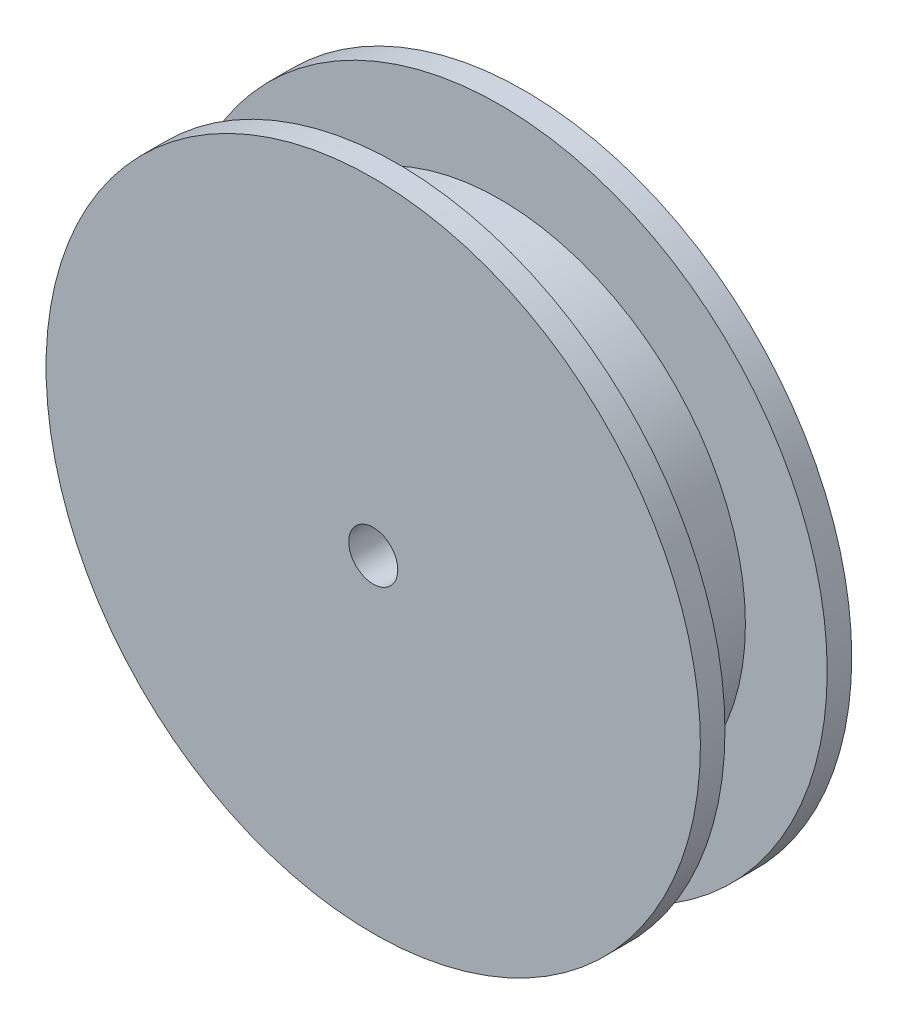
ISO-10303-21;
HEADER;
FILE_DESCRIPTION(('STEP AP214'),'2;1');
FILE_NAME('part.step','',(''),(''),'','','');
FILE_SCHEMA(('AUTOMOTIVE_DESIGN { 1 0 10303 214 1 1 1 1 }'));
ENDSEC;
DATA;
#1=APPLICATION_CONTEXT('core data for automotive mechanical design processes');
#2=APPLICATION_PROTOCOL_DEFINITION('international standard','automotive_design',2000,#1);
#3=PRODUCT_CONTEXT('',#1,'mechanical');
#4=PRODUCT('Part','Part','',(#3));
#5=PRODUCT_RELATED_PRODUCT_CATEGORY('part','',(#4));
#6=PRODUCT_DEFINITION_FORMATION('','',#4);
#7=PRODUCT_DEFINITION_CONTEXT('part definition',#1,'design');
#8=PRODUCT_DEFINITION('design','',#6,#7);
#9=PRODUCT_DEFINITION_SHAPE('','',#8);
#10=(LENGTH_UNIT() NAMED_UNIT(*) SI_UNIT(.MILLI.,.METRE.));
#11=(NAMED_UNIT(*) PLANE_ANGLE_UNIT() SI_UNIT($,.RADIAN.));
#12=(NAMED_UNIT(*) SI_UNIT($,.STERADIAN.) SOLID_ANGLE_UNIT());
#13=UNCERTAINTY_MEASURE_WITH_UNIT(LENGTH_MEASURE(1.E-05),#10,'distance_accuracy_value','');
#14=(GEOMETRIC_REPRESENTATION_CONTEXT(3) GLOBAL_UNCERTAINTY_ASSIGNED_CONTEXT((#13)) GLOBAL_UNIT_ASSIGNED_CONTEXT((#10,
#11,#12)) REPRESENTATION_CONTEXT('',''));
#15=CARTESIAN_POINT('',(0.,0.,0.));
#16=DIRECTION('',(0.,0.,1.));
#17=DIRECTION('',(1.,0.,0.));
#18=AXIS2_PLACEMENT_3D('',#15,#16,#17);
#19=CARTESIAN_POINT('',(0.,0.,18.5));
#20=DIRECTION('',(0.,0.,-1.));
#21=DIRECTION('',(-1.,0.,0.));
#22=AXIS2_PLACEMENT_3D('',#19,#20,#21);
#23=CYLINDRICAL_SURFACE('',#22,40.);
#24=CARTESIAN_POINT('',(0.,0.,0.));
#25=DIRECTION('',(0.,0.,1.));
#26=DIRECTION('',(1.,0.,0.));
#27=AXIS2_PLACEMENT_3D('',#24,#25,#26);
#28=CIRCLE('',#27,40.);
#29=CARTESIAN_POINT('',(40.,0.,0.));
#30=VERTEX_POINT('',#29);
#31=EDGE_CURVE('E50',#30,#30,#28,.T.);
#32=ORIENTED_EDGE('',*,*,#31,.T.);
#33=EDGE_LOOP('',(#32));
#34=FACE_BOUND('',#33,.T.);
#35=CARTESIAN_POINT('',(0.,0.,3.));
#36=DIRECTION('',(0.,0.,1.));
#37=DIRECTION('',(1.,0.,0.));
#38=AXIS2_PLACEMENT_3D('',#35,#36,#37);
#39=CIRCLE('',#38,40.);
#40=CARTESIAN_POINT('',(40.,0.,3.));
#41=VERTEX_POINT('',#40);
#42=EDGE_CURVE('E54',#41,#41,#39,.T.);
#43=ORIENTED_EDGE('',*,*,#42,.F.);
#44=EDGE_LOOP('',(#43));
#45=FACE_BOUND('',#44,.T.);
#46=ADVANCED_FACE('F33',(#34,#45),#23,.T.);
#47=CARTESIAN_POINT('',(0.,0.,15.5));
#48=DIRECTION('',(0.,0.,1.));
#49=DIRECTION('',(1.,0.,0.));
#50=AXIS2_PLACEMENT_3D('',#47,#48,#49);
#51=CIRCLE('',#50,40.);
#52=CARTESIAN_POINT('',(40.,0.,15.5));
#53=VERTEX_POINT('',#52);
#54=EDGE_CURVE('E37',#53,#53,#51,.T.);
#55=ORIENTED_EDGE('',*,*,#54,.T.);
#56=EDGE_LOOP('',(#55));
#57=FACE_BOUND('',#56,.T.);
#58=CARTESIAN_POINT('',(0.,0.,18.5));
#59=DIRECTION('',(0.,0.,1.));
#60=DIRECTION('',(1.,0.,0.));
#61=AXIS2_PLACEMENT_3D('',#58,#59,#60);
#62=CIRCLE('',#61,40.);
#63=CARTESIAN_POINT('',(40.,0.,18.5));
#64=VERTEX_POINT('',#63);
#65=EDGE_CURVE('E41',#64,#64,#62,.T.);
#66=ORIENTED_EDGE('',*,*,#65,.F.);
#67=EDGE_LOOP('',(#66));
#68=FACE_BOUND('',#67,.T.);
#69=ADVANCED_FACE('F35',(#57,#68),#23,.T.);
#70=CARTESIAN_POINT('',(0.,0.,18.5));
#71=DIRECTION('',(0.,0.,-1.));
#72=DIRECTION('',(-1.,0.,0.));
#73=AXIS2_PLACEMENT_3D('',#70,#71,#72);
#74=CYLINDRICAL_SURFACE('',#73,3.);
#75=CARTESIAN_POINT('',(0.,0.,18.5));
#76=DIRECTION('',(0.,0.,1.));
#77=DIRECTION('',(1.,0.,0.));
#78=AXIS2_PLACEMENT_3D('',#75,#76,#77);
#79=CIRCLE('',#78,3.);
#80=CARTESIAN_POINT('',(3.,0.,18.5));
#81=VERTEX_POINT('',#80);
#82=EDGE_CURVE('E10',#81,#81,#79,.T.);
#83=ORIENTED_EDGE('',*,*,#82,.T.);
#84=EDGE_LOOP('',(#83));
#85=FACE_BOUND('',#84,.T.);
#86=CARTESIAN_POINT('',(0.,0.,0.));
#87=DIRECTION('',(0.,0.,1.));
#88=DIRECTION('',(1.,0.,0.));
#89=AXIS2_PLACEMENT_3D('',#86,#87,#88);
#90=CIRCLE('',#89,3.);
#91=CARTESIAN_POINT('',(3.,0.,0.));
#92=VERTEX_POINT('',#91);
#93=EDGE_CURVE('E46',#92,#92,#90,.T.);
#94=ORIENTED_EDGE('',*,*,#93,.F.);
#95=EDGE_LOOP('',(#94));
#96=FACE_BOUND('',#95,.T.);
#97=ADVANCED_FACE('F87',(#85,#96),#74,.F.);
#98=CARTESIAN_POINT('',(0.,0.,18.5));
#99=DIRECTION('',(0.,0.,1.));
#100=DIRECTION('',(1.,0.,0.));
#101=AXIS2_PLACEMENT_3D('',#98,#99,#100);
#102=PLANE('',#101);
#103=ORIENTED_EDGE('',*,*,#65,.T.);
#104=EDGE_LOOP('',(#103));
#105=FACE_BOUND('',#104,.T.);
#106=ORIENTED_EDGE('',*,*,#82,.F.);
#107=EDGE_LOOP('',(#106));
#108=FACE_BOUND('',#107,.T.);
#109=ADVANCED_FACE('F94',(#105,#108),#102,.T.);
#110=CARTESIAN_POINT('',(0.,0.,0.));
#111=DIRECTION('',(0.,0.,1.));
#112=DIRECTION('',(1.,0.,0.));
#113=AXIS2_PLACEMENT_3D('',#110,#111,#112);
#114=PLANE('',#113);
#115=ORIENTED_EDGE('',*,*,#31,.F.);
#116=EDGE_LOOP('',(#115));
#117=FACE_BOUND('',#116,.T.);
#118=ORIENTED_EDGE('',*,*,#93,.T.);
#119=EDGE_LOOP('',(#118));
#120=FACE_BOUND('',#119,.T.);
#121=ADVANCED_FACE('F80',(#117,#120),#114,.F.);
#122=CARTESIAN_POINT('',(0.,0.,15.5));
#123=DIRECTION('',(0.,0.,1.));
#124=DIRECTION('',(1.,0.,0.));
#125=AXIS2_PLACEMENT_3D('',#122,#123,#124);
#126=PLANE('',#125);
#127=CARTESIAN_POINT('',(0.,0.,15.5));
#128=DIRECTION('',(0.,0.,1.));
#129=DIRECTION('',(1.,0.,0.));
#130=AXIS2_PLACEMENT_3D('',#127,#128,#129);
#131=CIRCLE('',#130,30.);
#132=CARTESIAN_POINT('',(30.,0.,15.5));
#133=VERTEX_POINT('',#132);
#134=EDGE_CURVE('E56',#133,#133,#131,.T.);
#135=ORIENTED_EDGE('',*,*,#134,.T.);
#136=EDGE_LOOP('',(#135));
#137=FACE_BOUND('',#136,.T.);
#138=ORIENTED_EDGE('',*,*,#54,.F.);
#139=EDGE_LOOP('',(#138));
#140=FACE_BOUND('',#139,.T.);
#141=ADVANCED_FACE('F72',(#137,#140),#126,.F.);
#142=CARTESIAN_POINT('',(0.,0.,3.));
#143=DIRECTION('',(0.,0.,1.));
#144=DIRECTION('',(1.,0.,0.));
#145=AXIS2_PLACEMENT_3D('',#142,#143,#144);
#146=PLANE('',#145);
#147=CARTESIAN_POINT('',(0.,0.,3.));
#148=DIRECTION('',(0.,0.,1.));
#149=DIRECTION('',(1.,0.,0.));
#150=AXIS2_PLACEMENT_3D('',#147,#148,#149);
#151=CIRCLE('',#150,30.);
#152=CARTESIAN_POINT('',(30.,0.,3.));
#153=VERTEX_POINT('',#152);
#154=EDGE_CURVE('E61',#153,#153,#151,.T.);
#155=ORIENTED_EDGE('',*,*,#154,.F.);
#156=EDGE_LOOP('',(#155));
#157=FACE_BOUND('',#156,.T.);
#158=ORIENTED_EDGE('',*,*,#42,.T.);
#159=EDGE_LOOP('',(#158));
#160=FACE_BOUND('',#159,.T.);
#161=ADVANCED_FACE('F70',(#157,#160),#146,.T.);
#162=CARTESIAN_POINT('',(0.,0.,15.5));
#163=DIRECTION('',(0.,0.,-1.));
#164=DIRECTION('',(-1.,0.,0.));
#165=AXIS2_PLACEMENT_3D('',#162,#163,#164);
#166=CYLINDRICAL_SURFACE('',#165,30.);
#167=ORIENTED_EDGE('',*,*,#134,.F.);
#168=EDGE_LOOP('',(#167));
#169=FACE_BOUND('',#168,.T.);
#170=ORIENTED_EDGE('',*,*,#154,.T.);
#171=EDGE_LOOP('',(#170));
#172=FACE_BOUND('',#171,.T.);
#173=ADVANCED_FACE('F68',(#169,#172),#166,.T.);
#174=CLOSED_SHELL('',(#46,#69,#97,#109,#121,#141,#161,#173));
#175=MANIFOLD_SOLID_BREP('B2',#174);
#176=ADVANCED_BREP_SHAPE_REPRESENTATION('',(#18,#175),#14);
#177=SHAPE_DEFINITION_REPRESENTATION(#9,#176);
ENDSEC;
END-ISO-10303-21;
